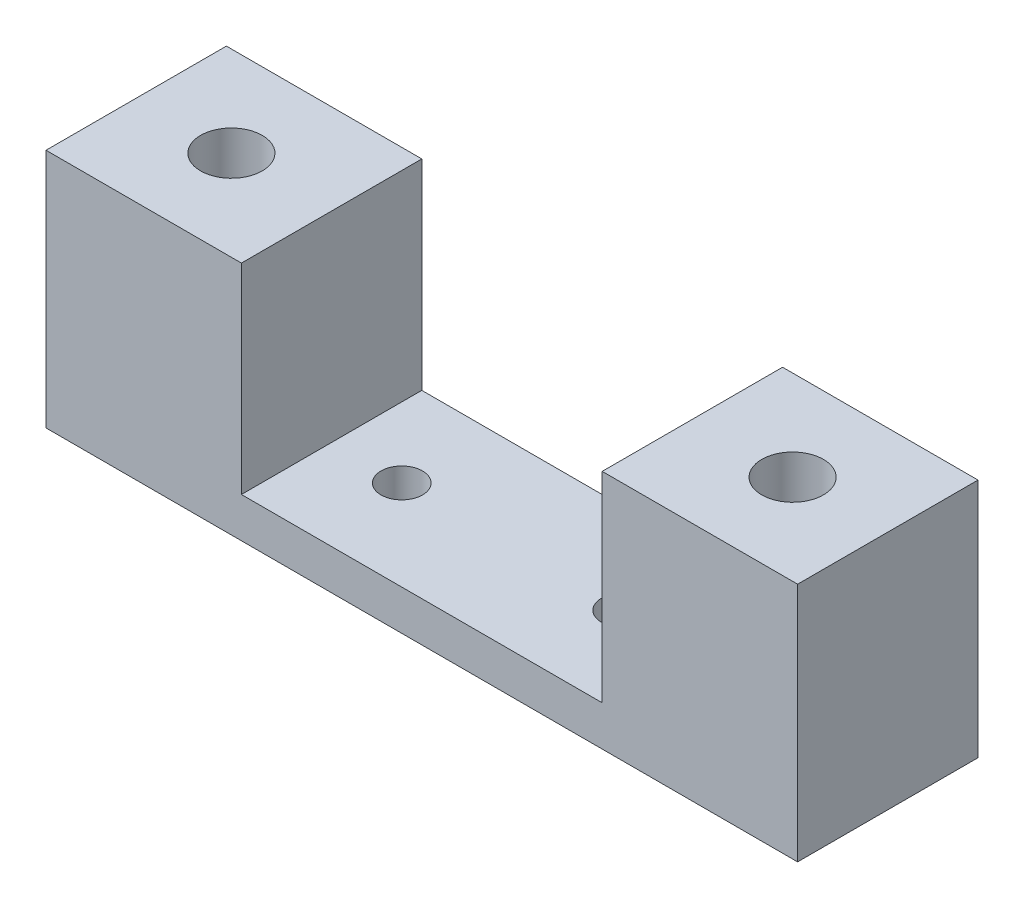
ISO-10303-21;
HEADER;
FILE_DESCRIPTION(('STEP AP214'),'2;1');
FILE_NAME('part.step','',(''),(''),'','','');
FILE_SCHEMA(('AUTOMOTIVE_DESIGN { 1 0 10303 214 1 1 1 1 }'));
ENDSEC;
DATA;
#1=APPLICATION_CONTEXT('core data for automotive mechanical design processes');
#2=APPLICATION_PROTOCOL_DEFINITION('international standard','automotive_design',2000,#1);
#3=PRODUCT_CONTEXT('',#1,'mechanical');
#4=PRODUCT('Part','Part','',(#3));
#5=PRODUCT_RELATED_PRODUCT_CATEGORY('part','',(#4));
#6=PRODUCT_DEFINITION_FORMATION('','',#4);
#7=PRODUCT_DEFINITION_CONTEXT('part definition',#1,'design');
#8=PRODUCT_DEFINITION('design','',#6,#7);
#9=PRODUCT_DEFINITION_SHAPE('','',#8);
#10=(LENGTH_UNIT() NAMED_UNIT(*) SI_UNIT(.MILLI.,.METRE.));
#11=(NAMED_UNIT(*) PLANE_ANGLE_UNIT() SI_UNIT($,.RADIAN.));
#12=(NAMED_UNIT(*) SI_UNIT($,.STERADIAN.) SOLID_ANGLE_UNIT());
#13=UNCERTAINTY_MEASURE_WITH_UNIT(LENGTH_MEASURE(1.E-05),#10,'distance_accuracy_value','');
#14=(GEOMETRIC_REPRESENTATION_CONTEXT(3) GLOBAL_UNCERTAINTY_ASSIGNED_CONTEXT((#13)) GLOBAL_UNIT_ASSIGNED_CONTEXT((#10,
#11,#12)) REPRESENTATION_CONTEXT('',''));
#15=CARTESIAN_POINT('',(0.,0.,0.));
#16=DIRECTION('',(0.,0.,1.));
#17=DIRECTION('',(1.,0.,0.));
#18=AXIS2_PLACEMENT_3D('',#15,#16,#17);
#19=CARTESIAN_POINT('',(65.5,-0.001000000000001,9.00000000000002));
#20=DIRECTION('',(0.,1.,0.));
#21=DIRECTION('',(0.,0.,1.));
#22=AXIS2_PLACEMENT_3D('',#19,#20,#21);
#23=CYLINDRICAL_SURFACE('',#22,3.075);
#24=CARTESIAN_POINT('',(65.5,24.,9.00000000000002));
#25=DIRECTION('',(0.,1.,0.));
#26=DIRECTION('',(0.,0.,-1.));
#27=AXIS2_PLACEMENT_3D('',#24,#25,#26);
#28=CIRCLE('',#27,3.075);
#29=CARTESIAN_POINT('',(65.5,24.,12.075));
#30=VERTEX_POINT('',#29);
#31=EDGE_CURVE('E274',#30,#30,#28,.T.);
#32=CARTESIAN_POINT('',(65.5,5.,9.00000000000002));
#33=DIRECTION('',(0.,-1.,0.));
#34=DIRECTION('',(0.,0.,-1.));
#35=AXIS2_PLACEMENT_3D('',#32,#33,#34);
#36=CIRCLE('',#35,3.075);
#37=CARTESIAN_POINT('',(65.5,5.,12.075));
#38=VERTEX_POINT('',#37);
#39=EDGE_CURVE('E37',#38,#38,#36,.F.);
#40=CARTESIAN_POINT('',(65.5,24.,12.075));
#41=CARTESIAN_POINT('',(65.5,23.8020833333333,12.075));
#42=CARTESIAN_POINT('',(65.5,23.6041666666667,12.075));
#43=CARTESIAN_POINT('',(65.5,23.2083333333333,12.075));
#44=CARTESIAN_POINT('',(65.5,23.0104166666667,12.075));
#45=CARTESIAN_POINT('',(65.5,22.6145833333333,12.075));
#46=CARTESIAN_POINT('',(65.5,22.4166666666667,12.075));
#47=CARTESIAN_POINT('',(65.5,22.0208333333333,12.075));
#48=CARTESIAN_POINT('',(65.5,21.8229166666667,12.075));
#49=CARTESIAN_POINT('',(65.5,21.4270833333333,12.075));
#50=CARTESIAN_POINT('',(65.5,21.2291666666667,12.075));
#51=CARTESIAN_POINT('',(65.5,20.8333333333333,12.075));
#52=CARTESIAN_POINT('',(65.5,20.6354166666667,12.075));
#53=CARTESIAN_POINT('',(65.5,20.2395833333333,12.075));
#54=CARTESIAN_POINT('',(65.5,20.0416666666667,12.075));
#55=CARTESIAN_POINT('',(65.5,19.6458333333333,12.075));
#56=CARTESIAN_POINT('',(65.5,19.4479166666667,12.075));
#57=CARTESIAN_POINT('',(65.5,19.0520833333333,12.075));
#58=CARTESIAN_POINT('',(65.5,18.8541666666667,12.075));
#59=CARTESIAN_POINT('',(65.5,18.4583333333333,12.075));
#60=CARTESIAN_POINT('',(65.5,18.2604166666667,12.075));
#61=CARTESIAN_POINT('',(65.5,17.8645833333333,12.075));
#62=CARTESIAN_POINT('',(65.5,17.6666666666667,12.075));
#63=CARTESIAN_POINT('',(65.5,17.2708333333333,12.075));
#64=CARTESIAN_POINT('',(65.5,17.0729166666667,12.075));
#65=CARTESIAN_POINT('',(65.5,16.6770833333333,12.075));
#66=CARTESIAN_POINT('',(65.5,16.4791666666667,12.075));
#67=CARTESIAN_POINT('',(65.5,16.0833333333333,12.075));
#68=CARTESIAN_POINT('',(65.5,15.8854166666667,12.075));
#69=CARTESIAN_POINT('',(65.5,15.4895833333333,12.075));
#70=CARTESIAN_POINT('',(65.5,15.2916666666667,12.075));
#71=CARTESIAN_POINT('',(65.5,14.8958333333333,12.075));
#72=CARTESIAN_POINT('',(65.5,14.6979166666667,12.075));
#73=CARTESIAN_POINT('',(65.5,14.3020833333333,12.075));
#74=CARTESIAN_POINT('',(65.5,14.1041666666667,12.075));
#75=CARTESIAN_POINT('',(65.5,13.7083333333333,12.075));
#76=CARTESIAN_POINT('',(65.5,13.5104166666667,12.075));
#77=CARTESIAN_POINT('',(65.5,13.1145833333333,12.075));
#78=CARTESIAN_POINT('',(65.5,12.9166666666667,12.075));
#79=CARTESIAN_POINT('',(65.5,12.5208333333333,12.075));
#80=CARTESIAN_POINT('',(65.5,12.3229166666667,12.075));
#81=CARTESIAN_POINT('',(65.5,11.9270833333333,12.075));
#82=CARTESIAN_POINT('',(65.5,11.7291666666667,12.075));
#83=CARTESIAN_POINT('',(65.5,11.3333333333333,12.075));
#84=CARTESIAN_POINT('',(65.5,11.1354166666667,12.075));
#85=CARTESIAN_POINT('',(65.5,10.7395833333333,12.075));
#86=CARTESIAN_POINT('',(65.5,10.5416666666667,12.075));
#87=CARTESIAN_POINT('',(65.5,10.1458333333333,12.075));
#88=CARTESIAN_POINT('',(65.5,9.94791666666667,12.075));
#89=CARTESIAN_POINT('',(65.5,9.55208333333333,12.075));
#90=CARTESIAN_POINT('',(65.5,9.35416666666667,12.075));
#91=CARTESIAN_POINT('',(65.5,8.95833333333333,12.075));
#92=CARTESIAN_POINT('',(65.5,8.76041666666667,12.075));
#93=CARTESIAN_POINT('',(65.5,8.36458333333333,12.075));
#94=CARTESIAN_POINT('',(65.5,8.16666666666667,12.075));
#95=CARTESIAN_POINT('',(65.5,7.77083333333333,12.075));
#96=CARTESIAN_POINT('',(65.5,7.57291666666667,12.075));
#97=CARTESIAN_POINT('',(65.5,7.17708333333333,12.075));
#98=CARTESIAN_POINT('',(65.5,6.97916666666667,12.075));
#99=CARTESIAN_POINT('',(65.5,6.58333333333333,12.075));
#100=CARTESIAN_POINT('',(65.5,6.38541666666667,12.075));
#101=CARTESIAN_POINT('',(65.5,5.98958333333333,12.075));
#102=CARTESIAN_POINT('',(65.5,5.79166666666667,12.075));
#103=CARTESIAN_POINT('',(65.5,5.39583333333333,12.075));
#104=CARTESIAN_POINT('',(65.5,5.19791666666667,12.075));
#105=CARTESIAN_POINT('',(65.5,5.,12.075));
#106=B_SPLINE_CURVE_WITH_KNOTS('',3,(#40,#41,#42,#43,#44,#45,#46,#47,#48,#49,#50,#51,#52,#53,
#54,#55,#56,#57,#58,#59,#60,#61,#62,#63,#64,#65,#66,#67,#68,#69,#70,#71,#72,#73,#74,#75,#76,#77,
#78,#79,#80,#81,#82,#83,#84,#85,#86,#87,#88,#89,#90,#91,#92,#93,#94,#95,#96,#97,#98,#99,#100,
#101,#102,#103,#104,#105),.UNSPECIFIED.,.F.,.F.,(4,2,2,2,2,2,2,2,2,2,2,2,2,2,2,2,2,2,2,2,2,2,2,
2,2,2,2,2,2,2,2,2,4),(0.,0.593750000000001,1.1875,1.78125,2.375,2.96875,3.5625,4.15625,4.75,
5.34375,5.9375,6.53125,7.125,7.71875,8.3125,8.90625,9.5,10.09375,10.6875,11.28125,11.875,
12.46875,13.0625,13.65625,14.25,14.84375,15.4375,16.03125,16.625,17.21875,17.8125,18.40625,19.),.UNSPECIFIED.);
#107=EDGE_CURVE('BSEAM33',#30,#38,#106,.T.);
#108=ORIENTED_EDGE('',*,*,#31,.T.);
#109=ORIENTED_EDGE('',*,*,#39,.F.);
#110=ORIENTED_EDGE('',*,*,#107,.T.);
#111=ORIENTED_EDGE('',*,*,#107,.F.);
#112=EDGE_LOOP('',(#108,#110,#109,#111));
#113=FACE_BOUND('',#112,.T.);
#114=ADVANCED_FACE('F33',(#113),#23,.F.);
#115=CARTESIAN_POINT('',(9.5,-0.001000000000001,9.));
#116=DIRECTION('',(0.,1.,0.));
#117=DIRECTION('',(0.,0.,1.));
#118=AXIS2_PLACEMENT_3D('',#115,#116,#117);
#119=CYLINDRICAL_SURFACE('',#118,3.075);
#120=CARTESIAN_POINT('',(9.5,24.,9.));
#121=DIRECTION('',(0.,1.,0.));
#122=DIRECTION('',(0.,0.,1.));
#123=AXIS2_PLACEMENT_3D('',#120,#121,#122);
#124=CIRCLE('',#123,3.075);
#125=CARTESIAN_POINT('',(9.5,24.,12.075));
#126=VERTEX_POINT('',#125);
#127=EDGE_CURVE('E277',#126,#126,#124,.T.);
#128=CARTESIAN_POINT('',(9.5,5.,9.));
#129=DIRECTION('',(0.,-1.,0.));
#130=DIRECTION('',(0.,0.,-1.));
#131=AXIS2_PLACEMENT_3D('',#128,#129,#130);
#132=CIRCLE('',#131,3.075);
#133=CARTESIAN_POINT('',(9.5,5.,12.075));
#134=VERTEX_POINT('',#133);
#135=EDGE_CURVE('E264',#134,#134,#132,.F.);
#136=CARTESIAN_POINT('',(9.5,24.,12.075));
#137=CARTESIAN_POINT('',(9.5,23.8020833333333,12.075));
#138=CARTESIAN_POINT('',(9.5,23.6041666666667,12.075));
#139=CARTESIAN_POINT('',(9.5,23.2083333333333,12.075));
#140=CARTESIAN_POINT('',(9.5,23.0104166666667,12.075));
#141=CARTESIAN_POINT('',(9.5,22.6145833333333,12.075));
#142=CARTESIAN_POINT('',(9.5,22.4166666666667,12.075));
#143=CARTESIAN_POINT('',(9.5,22.0208333333333,12.075));
#144=CARTESIAN_POINT('',(9.5,21.8229166666667,12.075));
#145=CARTESIAN_POINT('',(9.5,21.4270833333333,12.075));
#146=CARTESIAN_POINT('',(9.5,21.2291666666667,12.075));
#147=CARTESIAN_POINT('',(9.5,20.8333333333333,12.075));
#148=CARTESIAN_POINT('',(9.5,20.6354166666667,12.075));
#149=CARTESIAN_POINT('',(9.5,20.2395833333333,12.075));
#150=CARTESIAN_POINT('',(9.5,20.0416666666667,12.075));
#151=CARTESIAN_POINT('',(9.5,19.6458333333333,12.075));
#152=CARTESIAN_POINT('',(9.5,19.4479166666667,12.075));
#153=CARTESIAN_POINT('',(9.5,19.0520833333333,12.075));
#154=CARTESIAN_POINT('',(9.5,18.8541666666667,12.075));
#155=CARTESIAN_POINT('',(9.5,18.4583333333333,12.075));
#156=CARTESIAN_POINT('',(9.5,18.2604166666667,12.075));
#157=CARTESIAN_POINT('',(9.5,17.8645833333333,12.075));
#158=CARTESIAN_POINT('',(9.5,17.6666666666667,12.075));
#159=CARTESIAN_POINT('',(9.5,17.2708333333333,12.075));
#160=CARTESIAN_POINT('',(9.5,17.0729166666667,12.075));
#161=CARTESIAN_POINT('',(9.5,16.6770833333333,12.075));
#162=CARTESIAN_POINT('',(9.5,16.4791666666667,12.075));
#163=CARTESIAN_POINT('',(9.5,16.0833333333333,12.075));
#164=CARTESIAN_POINT('',(9.5,15.8854166666667,12.075));
#165=CARTESIAN_POINT('',(9.5,15.4895833333333,12.075));
#166=CARTESIAN_POINT('',(9.5,15.2916666666667,12.075));
#167=CARTESIAN_POINT('',(9.5,14.8958333333333,12.075));
#168=CARTESIAN_POINT('',(9.5,14.6979166666667,12.075));
#169=CARTESIAN_POINT('',(9.5,14.3020833333333,12.075));
#170=CARTESIAN_POINT('',(9.5,14.1041666666667,12.075));
#171=CARTESIAN_POINT('',(9.5,13.7083333333333,12.075));
#172=CARTESIAN_POINT('',(9.5,13.5104166666667,12.075));
#173=CARTESIAN_POINT('',(9.5,13.1145833333333,12.075));
#174=CARTESIAN_POINT('',(9.5,12.9166666666667,12.075));
#175=CARTESIAN_POINT('',(9.5,12.5208333333333,12.075));
#176=CARTESIAN_POINT('',(9.5,12.3229166666667,12.075));
#177=CARTESIAN_POINT('',(9.5,11.9270833333333,12.075));
#178=CARTESIAN_POINT('',(9.5,11.7291666666667,12.075));
#179=CARTESIAN_POINT('',(9.5,11.3333333333333,12.075));
#180=CARTESIAN_POINT('',(9.5,11.1354166666667,12.075));
#181=CARTESIAN_POINT('',(9.5,10.7395833333333,12.075));
#182=CARTESIAN_POINT('',(9.5,10.5416666666667,12.075));
#183=CARTESIAN_POINT('',(9.5,10.1458333333333,12.075));
#184=CARTESIAN_POINT('',(9.5,9.94791666666667,12.075));
#185=CARTESIAN_POINT('',(9.5,9.55208333333333,12.075));
#186=CARTESIAN_POINT('',(9.5,9.35416666666667,12.075));
#187=CARTESIAN_POINT('',(9.5,8.95833333333333,12.075));
#188=CARTESIAN_POINT('',(9.5,8.76041666666667,12.075));
#189=CARTESIAN_POINT('',(9.5,8.36458333333333,12.075));
#190=CARTESIAN_POINT('',(9.5,8.16666666666667,12.075));
#191=CARTESIAN_POINT('',(9.5,7.77083333333333,12.075));
#192=CARTESIAN_POINT('',(9.5,7.57291666666667,12.075));
#193=CARTESIAN_POINT('',(9.5,7.17708333333333,12.075));
#194=CARTESIAN_POINT('',(9.5,6.97916666666667,12.075));
#195=CARTESIAN_POINT('',(9.5,6.58333333333333,12.075));
#196=CARTESIAN_POINT('',(9.5,6.38541666666667,12.075));
#197=CARTESIAN_POINT('',(9.5,5.98958333333333,12.075));
#198=CARTESIAN_POINT('',(9.5,5.79166666666667,12.075));
#199=CARTESIAN_POINT('',(9.5,5.39583333333333,12.075));
#200=CARTESIAN_POINT('',(9.5,5.19791666666667,12.075));
#201=CARTESIAN_POINT('',(9.5,5.,12.075));
#202=B_SPLINE_CURVE_WITH_KNOTS('',3,(#136,#137,#138,#139,#140,#141,#142,#143,#144,#145,#146,
#147,#148,#149,#150,#151,#152,#153,#154,#155,#156,#157,#158,#159,#160,#161,#162,#163,#164,#165,
#166,#167,#168,#169,#170,#171,#172,#173,#174,#175,#176,#177,#178,#179,#180,#181,#182,#183,#184,
#185,#186,#187,#188,#189,#190,#191,#192,#193,#194,#195,#196,#197,#198,#199,#200,#201),
.UNSPECIFIED.,.F.,.F.,(4,2,2,2,2,2,2,2,2,2,2,2,2,2,2,2,2,2,2,2,2,2,2,2,2,2,2,2,2,2,2,2,4),(0.,
0.593750000000001,1.1875,1.78125,2.375,2.96875,3.5625,4.15625,4.75,5.34375,5.9375,6.53125,7.125,
7.71875,8.3125,8.90625,9.5,10.09375,10.6875,11.28125,11.875,12.46875,13.0625,13.65625,14.25,
14.84375,15.4375,16.03125,16.625,17.21875,17.8125,18.40625,19.),.UNSPECIFIED.);
#203=EDGE_CURVE('BSEAM352',#126,#134,#202,.T.);
#204=ORIENTED_EDGE('',*,*,#127,.T.);
#205=ORIENTED_EDGE('',*,*,#135,.F.);
#206=ORIENTED_EDGE('',*,*,#203,.T.);
#207=ORIENTED_EDGE('',*,*,#203,.F.);
#208=EDGE_LOOP('',(#204,#206,#205,#207));
#209=FACE_BOUND('',#208,.T.);
#210=ADVANCED_FACE('F352',(#209),#119,.F.);
#211=CARTESIAN_POINT('',(0.,24.,0.));
#212=DIRECTION('',(0.,1.,0.));
#213=DIRECTION('',(0.,0.,1.));
#214=AXIS2_PLACEMENT_3D('',#211,#212,#213);
#215=PLANE('',#214);
#216=ORIENTED_EDGE('',*,*,#127,.F.);
#217=EDGE_LOOP('',(#216));
#218=FACE_BOUND('',#217,.T.);
#219=DIRECTION('',(0.,0.,1.));
#220=VECTOR('',#219,1.);
#221=CARTESIAN_POINT('',(19.5,24.,0.));
#222=LINE('',#221,#220);
#223=CARTESIAN_POINT('',(19.5,24.,0.));
#224=VERTEX_POINT('',#223);
#225=CARTESIAN_POINT('',(19.5,24.,18.));
#226=VERTEX_POINT('',#225);
#227=EDGE_CURVE('E292',#224,#226,#222,.T.);
#228=ORIENTED_EDGE('',*,*,#227,.F.);
#229=DIRECTION('',(-1.,0.,0.));
#230=VECTOR('',#229,1.);
#231=CARTESIAN_POINT('',(0.,24.,0.));
#232=LINE('',#231,#230);
#233=CARTESIAN_POINT('',(0.,24.,0.));
#234=VERTEX_POINT('',#233);
#235=EDGE_CURVE('E329',#224,#234,#232,.T.);
#236=ORIENTED_EDGE('',*,*,#235,.T.);
#237=DIRECTION('',(0.,0.,1.));
#238=VECTOR('',#237,1.);
#239=CARTESIAN_POINT('',(0.,24.,0.));
#240=LINE('',#239,#238);
#241=CARTESIAN_POINT('',(0.,24.,18.));
#242=VERTEX_POINT('',#241);
#243=EDGE_CURVE('E319',#234,#242,#240,.T.);
#244=ORIENTED_EDGE('',*,*,#243,.T.);
#245=DIRECTION('',(1.,0.,0.));
#246=VECTOR('',#245,1.);
#247=CARTESIAN_POINT('',(0.,24.,18.));
#248=LINE('',#247,#246);
#249=EDGE_CURVE('E324',#242,#226,#248,.T.);
#250=ORIENTED_EDGE('',*,*,#249,.T.);
#251=EDGE_LOOP('',(#228,#236,#244,#250));
#252=FACE_BOUND('',#251,.T.);
#253=ADVANCED_FACE('F354',(#218,#252),#215,.T.);
#254=CARTESIAN_POINT('',(0.,24.,0.));
#255=DIRECTION('',(1.,0.,0.));
#256=DIRECTION('',(0.,0.,-1.));
#257=AXIS2_PLACEMENT_3D('',#254,#255,#256);
#258=PLANE('',#257);
#259=DIRECTION('',(0.,0.,1.));
#260=VECTOR('',#259,1.);
#261=CARTESIAN_POINT('',(0.,0.,0.));
#262=LINE('',#261,#260);
#263=CARTESIAN_POINT('',(0.,0.,0.));
#264=VERTEX_POINT('',#263);
#265=CARTESIAN_POINT('',(0.,0.,18.));
#266=VERTEX_POINT('',#265);
#267=EDGE_CURVE('E311',#264,#266,#262,.T.);
#268=ORIENTED_EDGE('',*,*,#267,.T.);
#269=DIRECTION('',(0.,-1.,0.));
#270=VECTOR('',#269,1.);
#271=CARTESIAN_POINT('',(0.,24.,18.));
#272=LINE('',#271,#270);
#273=EDGE_CURVE('E11',#242,#266,#272,.T.);
#274=ORIENTED_EDGE('',*,*,#273,.F.);
#275=ORIENTED_EDGE('',*,*,#243,.F.);
#276=DIRECTION('',(0.,-1.,0.));
#277=VECTOR('',#276,1.);
#278=CARTESIAN_POINT('',(0.,24.,0.));
#279=LINE('',#278,#277);
#280=EDGE_CURVE('E333',#234,#264,#279,.T.);
#281=ORIENTED_EDGE('',*,*,#280,.T.);
#282=EDGE_LOOP('',(#268,#274,#275,#281));
#283=FACE_BOUND('',#282,.T.);
#284=ADVANCED_FACE('F35',(#283),#258,.F.);
#285=CARTESIAN_POINT('',(0.,24.,18.));
#286=DIRECTION('',(0.,0.,-1.));
#287=DIRECTION('',(-1.,0.,0.));
#288=AXIS2_PLACEMENT_3D('',#285,#286,#287);
#289=PLANE('',#288);
#290=DIRECTION('',(1.,0.,0.));
#291=VECTOR('',#290,1.);
#292=CARTESIAN_POINT('',(19.5,4.,18.));
#293=LINE('',#292,#291);
#294=CARTESIAN_POINT('',(19.5,4.,18.));
#295=VERTEX_POINT('',#294);
#296=CARTESIAN_POINT('',(55.5,4.,18.));
#297=VERTEX_POINT('',#296);
#298=EDGE_CURVE('E296',#295,#297,#293,.T.);
#299=ORIENTED_EDGE('',*,*,#298,.F.);
#300=DIRECTION('',(0.,1.,0.));
#301=VECTOR('',#300,1.);
#302=CARTESIAN_POINT('',(19.5,4.,18.));
#303=LINE('',#302,#301);
#304=EDGE_CURVE('E306',#295,#226,#303,.T.);
#305=ORIENTED_EDGE('',*,*,#304,.T.);
#306=ORIENTED_EDGE('',*,*,#249,.F.);
#307=ORIENTED_EDGE('',*,*,#273,.T.);
#308=DIRECTION('',(1.,0.,0.));
#309=VECTOR('',#308,1.);
#310=CARTESIAN_POINT('',(0.,0.,18.));
#311=LINE('',#310,#309);
#312=CARTESIAN_POINT('',(75.,0.,18.));
#313=VERTEX_POINT('',#312);
#314=EDGE_CURVE('E336',#266,#313,#311,.T.);
#315=ORIENTED_EDGE('',*,*,#314,.T.);
#316=DIRECTION('',(0.,-1.,0.));
#317=VECTOR('',#316,1.);
#318=CARTESIAN_POINT('',(75.,24.,18.));
#319=LINE('',#318,#317);
#320=CARTESIAN_POINT('',(75.,24.,18.));
#321=VERTEX_POINT('',#320);
#322=EDGE_CURVE('E42',#321,#313,#319,.T.);
#323=ORIENTED_EDGE('',*,*,#322,.F.);
#324=CARTESIAN_POINT('',(55.5,24.,18.));
#325=VERTEX_POINT('',#324);
#326=EDGE_CURVE('E322',#325,#321,#248,.T.);
#327=ORIENTED_EDGE('',*,*,#326,.F.);
#328=DIRECTION('',(0.,1.,0.));
#329=VECTOR('',#328,1.);
#330=CARTESIAN_POINT('',(55.5,4.,18.));
#331=LINE('',#330,#329);
#332=EDGE_CURVE('E315',#297,#325,#331,.T.);
#333=ORIENTED_EDGE('',*,*,#332,.F.);
#334=EDGE_LOOP('',(#299,#305,#306,#307,#315,#323,#327,#333));
#335=FACE_BOUND('',#334,.T.);
#336=ADVANCED_FACE('F400',(#335),#289,.F.);
#337=CARTESIAN_POINT('',(75.,24.,0.));
#338=DIRECTION('',(-1.,0.,0.));
#339=DIRECTION('',(0.,0.,1.));
#340=AXIS2_PLACEMENT_3D('',#337,#338,#339);
#341=PLANE('',#340);
#342=DIRECTION('',(0.,0.,-1.));
#343=VECTOR('',#342,1.);
#344=CARTESIAN_POINT('',(75.,0.,0.));
#345=LINE('',#344,#343);
#346=CARTESIAN_POINT('',(75.,0.,0.));
#347=VERTEX_POINT('',#346);
#348=EDGE_CURVE('E338',#313,#347,#345,.T.);
#349=ORIENTED_EDGE('',*,*,#348,.T.);
#350=DIRECTION('',(0.,-1.,0.));
#351=VECTOR('',#350,1.);
#352=CARTESIAN_POINT('',(75.,24.,0.));
#353=LINE('',#352,#351);
#354=CARTESIAN_POINT('',(75.,24.,0.));
#355=VERTEX_POINT('',#354);
#356=EDGE_CURVE('E343',#355,#347,#353,.T.);
#357=ORIENTED_EDGE('',*,*,#356,.F.);
#358=DIRECTION('',(0.,0.,-1.));
#359=VECTOR('',#358,1.);
#360=CARTESIAN_POINT('',(75.,24.,0.));
#361=LINE('',#360,#359);
#362=EDGE_CURVE('E327',#321,#355,#361,.T.);
#363=ORIENTED_EDGE('',*,*,#362,.F.);
#364=ORIENTED_EDGE('',*,*,#322,.T.);
#365=EDGE_LOOP('',(#349,#357,#363,#364));
#366=FACE_BOUND('',#365,.T.);
#367=ADVANCED_FACE('F397',(#366),#341,.F.);
#368=CARTESIAN_POINT('',(0.,24.,0.));
#369=DIRECTION('',(0.,0.,1.));
#370=DIRECTION('',(1.,0.,0.));
#371=AXIS2_PLACEMENT_3D('',#368,#369,#370);
#372=PLANE('',#371);
#373=ORIENTED_EDGE('',*,*,#235,.F.);
#374=DIRECTION('',(0.,1.,0.));
#375=VECTOR('',#374,1.);
#376=CARTESIAN_POINT('',(19.5,4.,0.));
#377=LINE('',#376,#375);
#378=CARTESIAN_POINT('',(19.5,4.,0.));
#379=VERTEX_POINT('',#378);
#380=EDGE_CURVE('E309',#379,#224,#377,.T.);
#381=ORIENTED_EDGE('',*,*,#380,.F.);
#382=DIRECTION('',(-1.,0.,0.));
#383=VECTOR('',#382,1.);
#384=CARTESIAN_POINT('',(19.5,4.,0.));
#385=LINE('',#384,#383);
#386=CARTESIAN_POINT('',(55.5,4.,0.));
#387=VERTEX_POINT('',#386);
#388=EDGE_CURVE('E303',#387,#379,#385,.T.);
#389=ORIENTED_EDGE('',*,*,#388,.F.);
#390=DIRECTION('',(0.,1.,0.));
#391=VECTOR('',#390,1.);
#392=CARTESIAN_POINT('',(55.5,4.,0.));
#393=LINE('',#392,#391);
#394=CARTESIAN_POINT('',(55.5,24.,0.));
#395=VERTEX_POINT('',#394);
#396=EDGE_CURVE('E312',#387,#395,#393,.T.);
#397=ORIENTED_EDGE('',*,*,#396,.T.);
#398=EDGE_CURVE('E330',#355,#395,#232,.T.);
#399=ORIENTED_EDGE('',*,*,#398,.F.);
#400=ORIENTED_EDGE('',*,*,#356,.T.);
#401=DIRECTION('',(-1.,0.,0.));
#402=VECTOR('',#401,1.);
#403=CARTESIAN_POINT('',(0.,0.,0.));
#404=LINE('',#403,#402);
#405=EDGE_CURVE('E323',#347,#264,#404,.T.);
#406=ORIENTED_EDGE('',*,*,#405,.T.);
#407=ORIENTED_EDGE('',*,*,#280,.F.);
#408=EDGE_LOOP('',(#373,#381,#389,#397,#399,#400,#406,#407));
#409=FACE_BOUND('',#408,.T.);
#410=ADVANCED_FACE('F390',(#409),#372,.F.);
#411=ORIENTED_EDGE('',*,*,#31,.F.);
#412=EDGE_LOOP('',(#411));
#413=FACE_BOUND('',#412,.T.);
#414=DIRECTION('',(0.,0.,-1.));
#415=VECTOR('',#414,1.);
#416=CARTESIAN_POINT('',(55.5,24.,0.));
#417=LINE('',#416,#415);
#418=EDGE_CURVE('E297',#325,#395,#417,.T.);
#419=ORIENTED_EDGE('',*,*,#418,.F.);
#420=ORIENTED_EDGE('',*,*,#326,.T.);
#421=ORIENTED_EDGE('',*,*,#362,.T.);
#422=ORIENTED_EDGE('',*,*,#398,.T.);
#423=EDGE_LOOP('',(#419,#420,#421,#422));
#424=FACE_BOUND('',#423,.T.);
#425=ADVANCED_FACE('F363',(#413,#424),#215,.T.);
#426=CARTESIAN_POINT('',(0.,0.,0.));
#427=DIRECTION('',(0.,1.,0.));
#428=DIRECTION('',(0.,0.,1.));
#429=AXIS2_PLACEMENT_3D('',#426,#427,#428);
#430=PLANE('',#429);
#431=DIRECTION('',(0.,0.,1.));
#432=VECTOR('',#431,1.);
#433=CARTESIAN_POINT('',(70.5,0.,6.11324865405189));
#434=LINE('',#433,#432);
#435=CARTESIAN_POINT('',(70.5,0.,6.11324865405189));
#436=VERTEX_POINT('',#435);
#437=CARTESIAN_POINT('',(70.5,0.,11.8867513459482));
#438=VERTEX_POINT('',#437);
#439=EDGE_CURVE('E208',#436,#438,#434,.T.);
#440=ORIENTED_EDGE('',*,*,#439,.F.);
#441=DIRECTION('',(0.866025403784438,0.,0.5));
#442=VECTOR('',#441,1.);
#443=CARTESIAN_POINT('',(65.5,0.,3.22649730810377));
#444=LINE('',#443,#442);
#445=CARTESIAN_POINT('',(65.5,0.,3.22649730810377));
#446=VERTEX_POINT('',#445);
#447=EDGE_CURVE('E50',#446,#436,#444,.T.);
#448=ORIENTED_EDGE('',*,*,#447,.F.);
#449=DIRECTION('',(0.866025403784439,0.,-0.5));
#450=VECTOR('',#449,1.);
#451=CARTESIAN_POINT('',(60.5,0.,6.11324865405189));
#452=LINE('',#451,#450);
#453=CARTESIAN_POINT('',(60.5,0.,6.11324865405189));
#454=VERTEX_POINT('',#453);
#455=EDGE_CURVE('E194',#454,#446,#452,.T.);
#456=ORIENTED_EDGE('',*,*,#455,.F.);
#457=DIRECTION('',(0.,0.,-1.));
#458=VECTOR('',#457,1.);
#459=CARTESIAN_POINT('',(60.5,0.,11.8867513459482));
#460=LINE('',#459,#458);
#461=CARTESIAN_POINT('',(60.5,0.,11.8867513459482));
#462=VERTEX_POINT('',#461);
#463=EDGE_CURVE('E197',#462,#454,#460,.T.);
#464=ORIENTED_EDGE('',*,*,#463,.F.);
#465=DIRECTION('',(-0.866025403784439,0.,-0.5));
#466=VECTOR('',#465,1.);
#467=CARTESIAN_POINT('',(65.5,0.,14.7735026918963));
#468=LINE('',#467,#466);
#469=CARTESIAN_POINT('',(65.5,0.,14.7735026918963));
#470=VERTEX_POINT('',#469);
#471=EDGE_CURVE('E213',#470,#462,#468,.T.);
#472=ORIENTED_EDGE('',*,*,#471,.F.);
#473=DIRECTION('',(-0.866025403784438,0.,0.5));
#474=VECTOR('',#473,1.);
#475=CARTESIAN_POINT('',(70.5,0.,11.8867513459482));
#476=LINE('',#475,#474);
#477=EDGE_CURVE('E210',#438,#470,#476,.T.);
#478=ORIENTED_EDGE('',*,*,#477,.F.);
#479=EDGE_LOOP('',(#440,#448,#456,#464,#472,#478));
#480=FACE_BOUND('',#479,.T.);
#481=DIRECTION('',(-0.866025403784439,0.,0.5));
#482=VECTOR('',#481,1.);
#483=CARTESIAN_POINT('',(14.5,0.,11.8867513459481));
#484=LINE('',#483,#482);
#485=CARTESIAN_POINT('',(14.5,0.,11.8867513459481));
#486=VERTEX_POINT('',#485);
#487=CARTESIAN_POINT('',(9.5,0.,14.7735026918963));
#488=VERTEX_POINT('',#487);
#489=EDGE_CURVE('E248',#486,#488,#484,.T.);
#490=ORIENTED_EDGE('',*,*,#489,.F.);
#491=DIRECTION('',(0.,0.,1.));
#492=VECTOR('',#491,1.);
#493=CARTESIAN_POINT('',(14.5,0.,6.11324865405187));
#494=LINE('',#493,#492);
#495=CARTESIAN_POINT('',(14.5,0.,6.11324865405187));
#496=VERTEX_POINT('',#495);
#497=EDGE_CURVE('E58',#496,#486,#494,.T.);
#498=ORIENTED_EDGE('',*,*,#497,.F.);
#499=DIRECTION('',(0.866025403784439,0.,0.5));
#500=VECTOR('',#499,1.);
#501=CARTESIAN_POINT('',(9.5,0.,3.22649730810374));
#502=LINE('',#501,#500);
#503=CARTESIAN_POINT('',(9.5,0.,3.22649730810374));
#504=VERTEX_POINT('',#503);
#505=EDGE_CURVE('E231',#504,#496,#502,.T.);
#506=ORIENTED_EDGE('',*,*,#505,.F.);
#507=DIRECTION('',(0.866025403784439,0.,-0.5));
#508=VECTOR('',#507,1.);
#509=CARTESIAN_POINT('',(4.5,0.,6.11324865405187));
#510=LINE('',#509,#508);
#511=CARTESIAN_POINT('',(4.5,0.,6.11324865405187));
#512=VERTEX_POINT('',#511);
#513=EDGE_CURVE('E257',#512,#504,#510,.T.);
#514=ORIENTED_EDGE('',*,*,#513,.F.);
#515=DIRECTION('',(0.,0.,-1.));
#516=VECTOR('',#515,1.);
#517=CARTESIAN_POINT('',(4.5,0.,11.8867513459481));
#518=LINE('',#517,#516);
#519=CARTESIAN_POINT('',(4.5,0.,11.8867513459481));
#520=VERTEX_POINT('',#519);
#521=EDGE_CURVE('E254',#520,#512,#518,.T.);
#522=ORIENTED_EDGE('',*,*,#521,.F.);
#523=DIRECTION('',(-0.866025403784438,0.,-0.500000000000001));
#524=VECTOR('',#523,1.);
#525=CARTESIAN_POINT('',(9.5,0.,14.7735026918963));
#526=LINE('',#525,#524);
#527=EDGE_CURVE('E251',#488,#520,#526,.T.);
#528=ORIENTED_EDGE('',*,*,#527,.F.);
#529=EDGE_LOOP('',(#490,#498,#506,#514,#522,#528));
#530=FACE_BOUND('',#529,.T.);
#531=CARTESIAN_POINT('',(48.5,0.,9.));
#532=DIRECTION('',(0.,1.,0.));
#533=DIRECTION('',(0.,0.,1.));
#534=AXIS2_PLACEMENT_3D('',#531,#532,#533);
#535=CIRCLE('',#534,2.075);
#536=CARTESIAN_POINT('',(48.5,0.,11.075));
#537=VERTEX_POINT('',#536);
#538=EDGE_CURVE('E283',#537,#537,#535,.F.);
#539=ORIENTED_EDGE('',*,*,#538,.F.);
#540=EDGE_LOOP('',(#539));
#541=FACE_BOUND('',#540,.T.);
#542=CARTESIAN_POINT('',(26.5,0.,9.));
#543=DIRECTION('',(0.,1.,0.));
#544=DIRECTION('',(0.,0.,1.));
#545=AXIS2_PLACEMENT_3D('',#542,#543,#544);
#546=CIRCLE('',#545,2.075);
#547=CARTESIAN_POINT('',(26.5,0.,11.075));
#548=VERTEX_POINT('',#547);
#549=EDGE_CURVE('E289',#548,#548,#546,.F.);
#550=ORIENTED_EDGE('',*,*,#549,.F.);
#551=EDGE_LOOP('',(#550));
#552=FACE_BOUND('',#551,.T.);
#553=ORIENTED_EDGE('',*,*,#267,.F.);
#554=ORIENTED_EDGE('',*,*,#405,.F.);
#555=ORIENTED_EDGE('',*,*,#348,.F.);
#556=ORIENTED_EDGE('',*,*,#314,.F.);
#557=EDGE_LOOP('',(#553,#554,#555,#556));
#558=FACE_BOUND('',#557,.T.);
#559=ADVANCED_FACE('F386',(#480,#530,#541,#552,#558),#430,.F.);
#560=CARTESIAN_POINT('',(19.5,4.,0.));
#561=DIRECTION('',(-1.,0.,0.));
#562=DIRECTION('',(0.,0.,1.));
#563=AXIS2_PLACEMENT_3D('',#560,#561,#562);
#564=PLANE('',#563);
#565=ORIENTED_EDGE('',*,*,#227,.T.);
#566=ORIENTED_EDGE('',*,*,#304,.F.);
#567=DIRECTION('',(0.,0.,1.));
#568=VECTOR('',#567,1.);
#569=CARTESIAN_POINT('',(19.5,4.,0.));
#570=LINE('',#569,#568);
#571=EDGE_CURVE('E293',#379,#295,#570,.T.);
#572=ORIENTED_EDGE('',*,*,#571,.F.);
#573=ORIENTED_EDGE('',*,*,#380,.T.);
#574=EDGE_LOOP('',(#565,#566,#572,#573));
#575=FACE_BOUND('',#574,.T.);
#576=ADVANCED_FACE('F383',(#575),#564,.F.);
#577=CARTESIAN_POINT('',(55.5,4.,0.));
#578=DIRECTION('',(1.,0.,0.));
#579=DIRECTION('',(0.,0.,-1.));
#580=AXIS2_PLACEMENT_3D('',#577,#578,#579);
#581=PLANE('',#580);
#582=ORIENTED_EDGE('',*,*,#418,.T.);
#583=ORIENTED_EDGE('',*,*,#396,.F.);
#584=DIRECTION('',(0.,0.,-1.));
#585=VECTOR('',#584,1.);
#586=CARTESIAN_POINT('',(55.5,4.,0.));
#587=LINE('',#586,#585);
#588=EDGE_CURVE('E300',#297,#387,#587,.T.);
#589=ORIENTED_EDGE('',*,*,#588,.F.);
#590=ORIENTED_EDGE('',*,*,#332,.T.);
#591=EDGE_LOOP('',(#582,#583,#589,#590));
#592=FACE_BOUND('',#591,.T.);
#593=ADVANCED_FACE('F379',(#592),#581,.F.);
#594=CARTESIAN_POINT('',(0.,4.,0.));
#595=DIRECTION('',(0.,1.,0.));
#596=DIRECTION('',(0.,0.,1.));
#597=AXIS2_PLACEMENT_3D('',#594,#595,#596);
#598=PLANE('',#597);
#599=CARTESIAN_POINT('',(48.5,4.,9.));
#600=DIRECTION('',(0.,1.,0.));
#601=DIRECTION('',(0.,0.,-1.));
#602=AXIS2_PLACEMENT_3D('',#599,#600,#601);
#603=CIRCLE('',#602,2.075);
#604=CARTESIAN_POINT('',(48.5,4.,6.925));
#605=VERTEX_POINT('',#604);
#606=EDGE_CURVE('E280',#605,#605,#603,.T.);
#607=ORIENTED_EDGE('',*,*,#606,.F.);
#608=EDGE_LOOP('',(#607));
#609=FACE_BOUND('',#608,.T.);
#610=CARTESIAN_POINT('',(26.5,4.,9.));
#611=DIRECTION('',(0.,1.,0.));
#612=DIRECTION('',(0.,0.,1.));
#613=AXIS2_PLACEMENT_3D('',#610,#611,#612);
#614=CIRCLE('',#613,2.075);
#615=CARTESIAN_POINT('',(26.5,4.,11.075));
#616=VERTEX_POINT('',#615);
#617=EDGE_CURVE('E286',#616,#616,#614,.T.);
#618=ORIENTED_EDGE('',*,*,#617,.F.);
#619=EDGE_LOOP('',(#618));
#620=FACE_BOUND('',#619,.T.);
#621=ORIENTED_EDGE('',*,*,#571,.T.);
#622=ORIENTED_EDGE('',*,*,#298,.T.);
#623=ORIENTED_EDGE('',*,*,#588,.T.);
#624=ORIENTED_EDGE('',*,*,#388,.T.);
#625=EDGE_LOOP('',(#621,#622,#623,#624));
#626=FACE_BOUND('',#625,.T.);
#627=ADVANCED_FACE('F375',(#609,#620,#626),#598,.T.);
#628=CARTESIAN_POINT('',(26.5,-0.00100000000000013,9.));
#629=DIRECTION('',(0.,1.,0.));
#630=DIRECTION('',(0.,0.,1.));
#631=AXIS2_PLACEMENT_3D('',#628,#629,#630);
#632=CYLINDRICAL_SURFACE('',#631,2.075);
#633=ORIENTED_EDGE('',*,*,#617,.T.);
#634=EDGE_LOOP('',(#633));
#635=FACE_BOUND('',#634,.T.);
#636=ORIENTED_EDGE('',*,*,#549,.T.);
#637=EDGE_LOOP('',(#636));
#638=FACE_BOUND('',#637,.T.);
#639=ADVANCED_FACE('F371',(#635,#638),#632,.F.);
#640=CARTESIAN_POINT('',(48.5,-0.00100000000000013,9.));
#641=DIRECTION('',(0.,1.,0.));
#642=DIRECTION('',(0.,0.,1.));
#643=AXIS2_PLACEMENT_3D('',#640,#641,#642);
#644=CYLINDRICAL_SURFACE('',#643,2.075);
#645=ORIENTED_EDGE('',*,*,#606,.T.);
#646=EDGE_LOOP('',(#645));
#647=FACE_BOUND('',#646,.T.);
#648=ORIENTED_EDGE('',*,*,#538,.T.);
#649=EDGE_LOOP('',(#648));
#650=FACE_BOUND('',#649,.T.);
#651=ADVANCED_FACE('F368',(#647,#650),#644,.F.);
#652=CARTESIAN_POINT('',(0.,5.,0.));
#653=DIRECTION('',(0.,-1.,0.));
#654=DIRECTION('',(0.,0.,-1.));
#655=AXIS2_PLACEMENT_3D('',#652,#653,#654);
#656=PLANE('',#655);
#657=DIRECTION('',(0.,0.,1.));
#658=VECTOR('',#657,1.);
#659=CARTESIAN_POINT('',(14.5,5.,6.11324865405187));
#660=LINE('',#659,#658);
#661=CARTESIAN_POINT('',(14.5,5.,6.11324865405187));
#662=VERTEX_POINT('',#661);
#663=CARTESIAN_POINT('',(14.5,5.,11.8867513459481));
#664=VERTEX_POINT('',#663);
#665=EDGE_CURVE('E227',#662,#664,#660,.T.);
#666=ORIENTED_EDGE('',*,*,#665,.T.);
#667=DIRECTION('',(-0.866025403784439,0.,0.5));
#668=VECTOR('',#667,1.);
#669=CARTESIAN_POINT('',(14.5,5.,11.8867513459481));
#670=LINE('',#669,#668);
#671=CARTESIAN_POINT('',(9.5,5.,14.7735026918963));
#672=VERTEX_POINT('',#671);
#673=EDGE_CURVE('E230',#664,#672,#670,.T.);
#674=ORIENTED_EDGE('',*,*,#673,.T.);
#675=DIRECTION('',(-0.866025403784438,0.,-0.500000000000001));
#676=VECTOR('',#675,1.);
#677=CARTESIAN_POINT('',(9.5,5.,14.7735026918963));
#678=LINE('',#677,#676);
#679=CARTESIAN_POINT('',(4.5,5.,11.8867513459481));
#680=VERTEX_POINT('',#679);
#681=EDGE_CURVE('E234',#672,#680,#678,.T.);
#682=ORIENTED_EDGE('',*,*,#681,.T.);
#683=DIRECTION('',(0.,0.,-1.));
#684=VECTOR('',#683,1.);
#685=CARTESIAN_POINT('',(4.5,5.,11.8867513459481));
#686=LINE('',#685,#684);
#687=CARTESIAN_POINT('',(4.5,5.,6.11324865405187));
#688=VERTEX_POINT('',#687);
#689=EDGE_CURVE('E237',#680,#688,#686,.T.);
#690=ORIENTED_EDGE('',*,*,#689,.T.);
#691=DIRECTION('',(0.866025403784439,0.,-0.5));
#692=VECTOR('',#691,1.);
#693=CARTESIAN_POINT('',(4.5,5.,6.11324865405187));
#694=LINE('',#693,#692);
#695=CARTESIAN_POINT('',(9.5,5.,3.22649730810374));
#696=VERTEX_POINT('',#695);
#697=EDGE_CURVE('E240',#688,#696,#694,.T.);
#698=ORIENTED_EDGE('',*,*,#697,.T.);
#699=DIRECTION('',(0.866025403784439,0.,0.5));
#700=VECTOR('',#699,1.);
#701=CARTESIAN_POINT('',(9.5,5.,3.22649730810374));
#702=LINE('',#701,#700);
#703=EDGE_CURVE('E243',#696,#662,#702,.T.);
#704=ORIENTED_EDGE('',*,*,#703,.T.);
#705=EDGE_LOOP('',(#666,#674,#682,#690,#698,#704));
#706=FACE_BOUND('',#705,.T.);
#707=ORIENTED_EDGE('',*,*,#135,.T.);
#708=EDGE_LOOP('',(#707));
#709=FACE_BOUND('',#708,.T.);
#710=ADVANCED_FACE('F350',(#706,#709),#656,.T.);
#711=CARTESIAN_POINT('',(14.5,5.,6.11324865405187));
#712=DIRECTION('',(1.,0.,0.));
#713=DIRECTION('',(0.,0.,-1.));
#714=AXIS2_PLACEMENT_3D('',#711,#712,#713);
#715=PLANE('',#714);
#716=ORIENTED_EDGE('',*,*,#497,.T.);
#717=DIRECTION('',(0.,-1.,0.));
#718=VECTOR('',#717,1.);
#719=CARTESIAN_POINT('',(14.5,5.,11.8867513459481));
#720=LINE('',#719,#718);
#721=EDGE_CURVE('E246',#664,#486,#720,.T.);
#722=ORIENTED_EDGE('',*,*,#721,.F.);
#723=ORIENTED_EDGE('',*,*,#665,.F.);
#724=DIRECTION('',(0.,-1.,0.));
#725=VECTOR('',#724,1.);
#726=CARTESIAN_POINT('',(14.5,5.,6.11324865405187));
#727=LINE('',#726,#725);
#728=EDGE_CURVE('E262',#662,#496,#727,.T.);
#729=ORIENTED_EDGE('',*,*,#728,.T.);
#730=EDGE_LOOP('',(#716,#722,#723,#729));
#731=FACE_BOUND('',#730,.T.);
#732=ADVANCED_FACE('F474',(#731),#715,.F.);
#733=CARTESIAN_POINT('',(9.5,5.,3.22649730810374));
#734=DIRECTION('',(0.5,0.,-0.866025403784439));
#735=DIRECTION('',(-0.866025403784439,0.,-0.5));
#736=AXIS2_PLACEMENT_3D('',#733,#734,#735);
#737=PLANE('',#736);
#738=ORIENTED_EDGE('',*,*,#505,.T.);
#739=ORIENTED_EDGE('',*,*,#728,.F.);
#740=ORIENTED_EDGE('',*,*,#703,.F.);
#741=DIRECTION('',(0.,-1.,0.));
#742=VECTOR('',#741,1.);
#743=CARTESIAN_POINT('',(9.5,5.,3.22649730810374));
#744=LINE('',#743,#742);
#745=EDGE_CURVE('E265',#696,#504,#744,.T.);
#746=ORIENTED_EDGE('',*,*,#745,.T.);
#747=EDGE_LOOP('',(#738,#739,#740,#746));
#748=FACE_BOUND('',#747,.T.);
#749=ADVANCED_FACE('F484',(#748),#737,.F.);
#750=CARTESIAN_POINT('',(4.5,5.,6.11324865405187));
#751=DIRECTION('',(-0.5,0.,-0.866025403784439));
#752=DIRECTION('',(-0.866025403784439,0.,0.5));
#753=AXIS2_PLACEMENT_3D('',#750,#751,#752);
#754=PLANE('',#753);
#755=ORIENTED_EDGE('',*,*,#513,.T.);
#756=ORIENTED_EDGE('',*,*,#745,.F.);
#757=ORIENTED_EDGE('',*,*,#697,.F.);
#758=DIRECTION('',(0.,-1.,0.));
#759=VECTOR('',#758,1.);
#760=CARTESIAN_POINT('',(4.5,5.,6.11324865405187));
#761=LINE('',#760,#759);
#762=EDGE_CURVE('E267',#688,#512,#761,.T.);
#763=ORIENTED_EDGE('',*,*,#762,.T.);
#764=EDGE_LOOP('',(#755,#756,#757,#763));
#765=FACE_BOUND('',#764,.T.);
#766=ADVANCED_FACE('F492',(#765),#754,.F.);
#767=CARTESIAN_POINT('',(4.5,5.,11.8867513459481));
#768=DIRECTION('',(-1.,0.,0.));
#769=DIRECTION('',(0.,0.,1.));
#770=AXIS2_PLACEMENT_3D('',#767,#768,#769);
#771=PLANE('',#770);
#772=ORIENTED_EDGE('',*,*,#521,.T.);
#773=ORIENTED_EDGE('',*,*,#762,.F.);
#774=ORIENTED_EDGE('',*,*,#689,.F.);
#775=DIRECTION('',(0.,-1.,0.));
#776=VECTOR('',#775,1.);
#777=CARTESIAN_POINT('',(4.5,5.,11.8867513459481));
#778=LINE('',#777,#776);
#779=EDGE_CURVE('E269',#680,#520,#778,.T.);
#780=ORIENTED_EDGE('',*,*,#779,.T.);
#781=EDGE_LOOP('',(#772,#773,#774,#780));
#782=FACE_BOUND('',#781,.T.);
#783=ADVANCED_FACE('F502',(#782),#771,.F.);
#784=CARTESIAN_POINT('',(9.5,5.,14.7735026918963));
#785=DIRECTION('',(-0.500000000000001,0.,0.866025403784438));
#786=DIRECTION('',(0.866025403784438,0.,0.500000000000001));
#787=AXIS2_PLACEMENT_3D('',#784,#785,#786);
#788=PLANE('',#787);
#789=ORIENTED_EDGE('',*,*,#527,.T.);
#790=ORIENTED_EDGE('',*,*,#779,.F.);
#791=ORIENTED_EDGE('',*,*,#681,.F.);
#792=DIRECTION('',(0.,-1.,0.));
#793=VECTOR('',#792,1.);
#794=CARTESIAN_POINT('',(9.5,5.,14.7735026918963));
#795=LINE('',#794,#793);
#796=EDGE_CURVE('E271',#672,#488,#795,.T.);
#797=ORIENTED_EDGE('',*,*,#796,.T.);
#798=EDGE_LOOP('',(#789,#790,#791,#797));
#799=FACE_BOUND('',#798,.T.);
#800=ADVANCED_FACE('F512',(#799),#788,.F.);
#801=CARTESIAN_POINT('',(14.5,5.,11.8867513459481));
#802=DIRECTION('',(0.5,0.,0.866025403784439));
#803=DIRECTION('',(0.866025403784439,0.,-0.5));
#804=AXIS2_PLACEMENT_3D('',#801,#802,#803);
#805=PLANE('',#804);
#806=ORIENTED_EDGE('',*,*,#489,.T.);
#807=ORIENTED_EDGE('',*,*,#796,.F.);
#808=ORIENTED_EDGE('',*,*,#673,.F.);
#809=ORIENTED_EDGE('',*,*,#721,.T.);
#810=EDGE_LOOP('',(#806,#807,#808,#809));
#811=FACE_BOUND('',#810,.T.);
#812=ADVANCED_FACE('F522',(#811),#805,.F.);
#813=CARTESIAN_POINT('',(0.,5.,0.));
#814=DIRECTION('',(0.,-1.,0.));
#815=DIRECTION('',(0.,0.,-1.));
#816=AXIS2_PLACEMENT_3D('',#813,#814,#815);
#817=PLANE('',#816);
#818=DIRECTION('',(0.866025403784438,0.,0.5));
#819=VECTOR('',#818,1.);
#820=CARTESIAN_POINT('',(65.5,5.,3.22649730810377));
#821=LINE('',#820,#819);
#822=CARTESIAN_POINT('',(65.5,5.,3.22649730810377));
#823=VERTEX_POINT('',#822);
#824=CARTESIAN_POINT('',(70.5,5.,6.11324865405189));
#825=VERTEX_POINT('',#824);
#826=EDGE_CURVE('E174',#823,#825,#821,.T.);
#827=ORIENTED_EDGE('',*,*,#826,.T.);
#828=DIRECTION('',(0.,0.,1.));
#829=VECTOR('',#828,1.);
#830=CARTESIAN_POINT('',(70.5,5.,6.11324865405189));
#831=LINE('',#830,#829);
#832=CARTESIAN_POINT('',(70.5,5.,11.8867513459482));
#833=VERTEX_POINT('',#832);
#834=EDGE_CURVE('E183',#825,#833,#831,.T.);
#835=ORIENTED_EDGE('',*,*,#834,.T.);
#836=DIRECTION('',(-0.866025403784438,0.,0.5));
#837=VECTOR('',#836,1.);
#838=CARTESIAN_POINT('',(70.5,5.,11.8867513459482));
#839=LINE('',#838,#837);
#840=CARTESIAN_POINT('',(65.5,5.,14.7735026918963));
#841=VERTEX_POINT('',#840);
#842=EDGE_CURVE('E188',#833,#841,#839,.T.);
#843=ORIENTED_EDGE('',*,*,#842,.T.);
#844=DIRECTION('',(-0.866025403784439,0.,-0.5));
#845=VECTOR('',#844,1.);
#846=CARTESIAN_POINT('',(65.5,5.,14.7735026918963));
#847=LINE('',#846,#845);
#848=CARTESIAN_POINT('',(60.5,5.,11.8867513459482));
#849=VERTEX_POINT('',#848);
#850=EDGE_CURVE('E201',#841,#849,#847,.T.);
#851=ORIENTED_EDGE('',*,*,#850,.T.);
#852=DIRECTION('',(0.,0.,-1.));
#853=VECTOR('',#852,1.);
#854=CARTESIAN_POINT('',(60.5,5.,11.8867513459482));
#855=LINE('',#854,#853);
#856=CARTESIAN_POINT('',(60.5,5.,6.11324865405189));
#857=VERTEX_POINT('',#856);
#858=EDGE_CURVE('E204',#849,#857,#855,.T.);
#859=ORIENTED_EDGE('',*,*,#858,.T.);
#860=DIRECTION('',(0.866025403784439,0.,-0.5));
#861=VECTOR('',#860,1.);
#862=CARTESIAN_POINT('',(60.5,5.,6.11324865405189));
#863=LINE('',#862,#861);
#864=EDGE_CURVE('E180',#857,#823,#863,.T.);
#865=ORIENTED_EDGE('',*,*,#864,.T.);
#866=EDGE_LOOP('',(#827,#835,#843,#851,#859,#865));
#867=FACE_BOUND('',#866,.T.);
#868=ORIENTED_EDGE('',*,*,#39,.T.);
#869=EDGE_LOOP('',(#868));
#870=FACE_BOUND('',#869,.T.);
#871=ADVANCED_FACE('F190',(#867,#870),#817,.T.);
#872=CARTESIAN_POINT('',(65.5,5.,3.22649730810377));
#873=DIRECTION('',(0.5,0.,-0.866025403784438));
#874=DIRECTION('',(-0.866025403784438,0.,-0.5));
#875=AXIS2_PLACEMENT_3D('',#872,#873,#874);
#876=PLANE('',#875);
#877=ORIENTED_EDGE('',*,*,#447,.T.);
#878=DIRECTION('',(0.,-1.,0.));
#879=VECTOR('',#878,1.);
#880=CARTESIAN_POINT('',(70.5,5.,6.11324865405189));
#881=LINE('',#880,#879);
#882=EDGE_CURVE('E170',#825,#436,#881,.T.);
#883=ORIENTED_EDGE('',*,*,#882,.F.);
#884=ORIENTED_EDGE('',*,*,#826,.F.);
#885=DIRECTION('',(0.,-1.,0.));
#886=VECTOR('',#885,1.);
#887=CARTESIAN_POINT('',(65.5,5.,3.22649730810377));
#888=LINE('',#887,#886);
#889=EDGE_CURVE('E218',#823,#446,#888,.T.);
#890=ORIENTED_EDGE('',*,*,#889,.T.);
#891=EDGE_LOOP('',(#877,#883,#884,#890));
#892=FACE_BOUND('',#891,.T.);
#893=ADVANCED_FACE('F172',(#892),#876,.F.);
#894=CARTESIAN_POINT('',(60.5,5.,6.11324865405189));
#895=DIRECTION('',(-0.5,0.,-0.866025403784439));
#896=DIRECTION('',(-0.866025403784439,0.,0.5));
#897=AXIS2_PLACEMENT_3D('',#894,#895,#896);
#898=PLANE('',#897);
#899=ORIENTED_EDGE('',*,*,#455,.T.);
#900=ORIENTED_EDGE('',*,*,#889,.F.);
#901=ORIENTED_EDGE('',*,*,#864,.F.);
#902=DIRECTION('',(0.,-1.,0.));
#903=VECTOR('',#902,1.);
#904=CARTESIAN_POINT('',(60.5,5.,6.11324865405189));
#905=LINE('',#904,#903);
#906=EDGE_CURVE('E220',#857,#454,#905,.T.);
#907=ORIENTED_EDGE('',*,*,#906,.T.);
#908=EDGE_LOOP('',(#899,#900,#901,#907));
#909=FACE_BOUND('',#908,.T.);
#910=ADVANCED_FACE('F549',(#909),#898,.F.);
#911=CARTESIAN_POINT('',(60.5,5.,11.8867513459482));
#912=DIRECTION('',(-1.,0.,0.));
#913=DIRECTION('',(0.,0.,1.));
#914=AXIS2_PLACEMENT_3D('',#911,#912,#913);
#915=PLANE('',#914);
#916=ORIENTED_EDGE('',*,*,#463,.T.);
#917=ORIENTED_EDGE('',*,*,#906,.F.);
#918=ORIENTED_EDGE('',*,*,#858,.F.);
#919=DIRECTION('',(0.,-1.,0.));
#920=VECTOR('',#919,1.);
#921=CARTESIAN_POINT('',(60.5,5.,11.8867513459482));
#922=LINE('',#921,#920);
#923=EDGE_CURVE('E222',#849,#462,#922,.T.);
#924=ORIENTED_EDGE('',*,*,#923,.T.);
#925=EDGE_LOOP('',(#916,#917,#918,#924));
#926=FACE_BOUND('',#925,.T.);
#927=ADVANCED_FACE('F558',(#926),#915,.F.);
#928=CARTESIAN_POINT('',(65.5,5.,14.7735026918963));
#929=DIRECTION('',(-0.5,0.,0.866025403784439));
#930=DIRECTION('',(0.866025403784439,0.,0.5));
#931=AXIS2_PLACEMENT_3D('',#928,#929,#930);
#932=PLANE('',#931);
#933=ORIENTED_EDGE('',*,*,#471,.T.);
#934=ORIENTED_EDGE('',*,*,#923,.F.);
#935=ORIENTED_EDGE('',*,*,#850,.F.);
#936=DIRECTION('',(0.,-1.,0.));
#937=VECTOR('',#936,1.);
#938=CARTESIAN_POINT('',(65.5,5.,14.7735026918963));
#939=LINE('',#938,#937);
#940=EDGE_CURVE('E224',#841,#470,#939,.T.);
#941=ORIENTED_EDGE('',*,*,#940,.T.);
#942=EDGE_LOOP('',(#933,#934,#935,#941));
#943=FACE_BOUND('',#942,.T.);
#944=ADVANCED_FACE('F568',(#943),#932,.F.);
#945=CARTESIAN_POINT('',(70.5,5.,11.8867513459482));
#946=DIRECTION('',(0.5,0.,0.866025403784438));
#947=DIRECTION('',(0.866025403784438,0.,-0.5));
#948=AXIS2_PLACEMENT_3D('',#945,#946,#947);
#949=PLANE('',#948);
#950=ORIENTED_EDGE('',*,*,#477,.T.);
#951=ORIENTED_EDGE('',*,*,#940,.F.);
#952=ORIENTED_EDGE('',*,*,#842,.F.);
#953=DIRECTION('',(0.,-1.,0.));
#954=VECTOR('',#953,1.);
#955=CARTESIAN_POINT('',(70.5,5.,11.8867513459482));
#956=LINE('',#955,#954);
#957=EDGE_CURVE('E179',#833,#438,#956,.T.);
#958=ORIENTED_EDGE('',*,*,#957,.T.);
#959=EDGE_LOOP('',(#950,#951,#952,#958));
#960=FACE_BOUND('',#959,.T.);
#961=ADVANCED_FACE('F578',(#960),#949,.F.);
#962=CARTESIAN_POINT('',(70.5,5.,6.11324865405189));
#963=DIRECTION('',(1.,0.,0.));
#964=DIRECTION('',(0.,0.,-1.));
#965=AXIS2_PLACEMENT_3D('',#962,#963,#964);
#966=PLANE('',#965);
#967=ORIENTED_EDGE('',*,*,#439,.T.);
#968=ORIENTED_EDGE('',*,*,#957,.F.);
#969=ORIENTED_EDGE('',*,*,#834,.F.);
#970=ORIENTED_EDGE('',*,*,#882,.T.);
#971=EDGE_LOOP('',(#967,#968,#969,#970));
#972=FACE_BOUND('',#971,.T.);
#973=ADVANCED_FACE('F184',(#972),#966,.F.);
#974=CLOSED_SHELL('',(#114,#210,#253,#284,#336,#367,#410,#425,#559,#576,#593,#627,#639,#651,
#710,#732,#749,#766,#783,#800,#812,#871,#893,#910,#927,#944,#961,#973));
#975=MANIFOLD_SOLID_BREP('B2',#974);
#976=ADVANCED_BREP_SHAPE_REPRESENTATION('',(#18,#975),#14);
#977=SHAPE_DEFINITION_REPRESENTATION(#9,#976);
ENDSEC;
END-ISO-10303-21;
